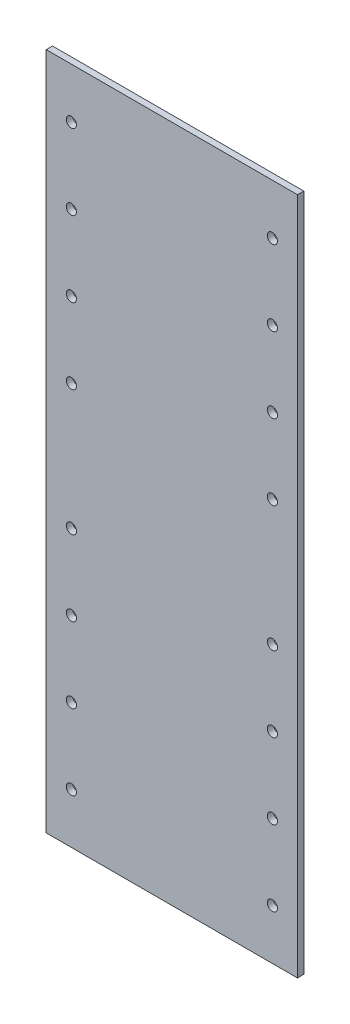
ISO-10303-21;
HEADER;
FILE_DESCRIPTION(('STEP AP214'),'2;1');
FILE_NAME('part.step','',(''),(''),'','','');
FILE_SCHEMA(('AUTOMOTIVE_DESIGN { 1 0 10303 214 1 1 1 1 }'));
ENDSEC;
DATA;
#1=APPLICATION_CONTEXT('core data for automotive mechanical design processes');
#2=APPLICATION_PROTOCOL_DEFINITION('international standard','automotive_design',2000,#1);
#3=PRODUCT_CONTEXT('',#1,'mechanical');
#4=PRODUCT('Part','Part','',(#3));
#5=PRODUCT_RELATED_PRODUCT_CATEGORY('part','',(#4));
#6=PRODUCT_DEFINITION_FORMATION('','',#4);
#7=PRODUCT_DEFINITION_CONTEXT('part definition',#1,'design');
#8=PRODUCT_DEFINITION('design','',#6,#7);
#9=PRODUCT_DEFINITION_SHAPE('','',#8);
#10=(LENGTH_UNIT() NAMED_UNIT(*) SI_UNIT(.MILLI.,.METRE.));
#11=(NAMED_UNIT(*) PLANE_ANGLE_UNIT() SI_UNIT($,.RADIAN.));
#12=(NAMED_UNIT(*) SI_UNIT($,.STERADIAN.) SOLID_ANGLE_UNIT());
#13=UNCERTAINTY_MEASURE_WITH_UNIT(LENGTH_MEASURE(1.E-05),#10,'distance_accuracy_value','');
#14=(GEOMETRIC_REPRESENTATION_CONTEXT(3) GLOBAL_UNCERTAINTY_ASSIGNED_CONTEXT((#13)) GLOBAL_UNIT_ASSIGNED_CONTEXT((#10,
#11,#12)) REPRESENTATION_CONTEXT('',''));
#15=CARTESIAN_POINT('',(0.,0.,0.));
#16=DIRECTION('',(0.,0.,1.));
#17=DIRECTION('',(1.,0.,0.));
#18=AXIS2_PLACEMENT_3D('',#15,#16,#17);
#19=CARTESIAN_POINT('',(63.5,-171.45,3.175));
#20=DIRECTION('',(-1.,0.,0.));
#21=DIRECTION('',(0.,0.,1.));
#22=AXIS2_PLACEMENT_3D('',#19,#20,#21);
#23=PLANE('',#22);
#24=DIRECTION('',(0.,1.,0.));
#25=VECTOR('',#24,1.);
#26=CARTESIAN_POINT('',(63.5,-171.45,0.));
#27=LINE('',#26,#25);
#28=CARTESIAN_POINT('',(63.5,-171.45,0.));
#29=VERTEX_POINT('',#28);
#30=CARTESIAN_POINT('',(63.5,171.45,0.));
#31=VERTEX_POINT('',#30);
#32=EDGE_CURVE('E96',#29,#31,#27,.T.);
#33=ORIENTED_EDGE('',*,*,#32,.T.);
#34=DIRECTION('',(0.,0.,-1.));
#35=VECTOR('',#34,1.);
#36=CARTESIAN_POINT('',(63.5,171.45,3.175));
#37=LINE('',#36,#35);
#38=CARTESIAN_POINT('',(63.5,171.45,3.175));
#39=VERTEX_POINT('',#38);
#40=EDGE_CURVE('E11',#39,#31,#37,.T.);
#41=ORIENTED_EDGE('',*,*,#40,.F.);
#42=DIRECTION('',(0.,1.,0.));
#43=VECTOR('',#42,1.);
#44=CARTESIAN_POINT('',(63.5,-171.45,3.175));
#45=LINE('',#44,#43);
#46=CARTESIAN_POINT('',(63.5,-171.45,3.175));
#47=VERTEX_POINT('',#46);
#48=EDGE_CURVE('E84',#47,#39,#45,.T.);
#49=ORIENTED_EDGE('',*,*,#48,.F.);
#50=DIRECTION('',(0.,0.,-1.));
#51=VECTOR('',#50,1.);
#52=CARTESIAN_POINT('',(63.5,-171.45,3.175));
#53=LINE('',#52,#51);
#54=EDGE_CURVE('E92',#47,#29,#53,.T.);
#55=ORIENTED_EDGE('',*,*,#54,.T.);
#56=EDGE_LOOP('',(#33,#41,#49,#55));
#57=FACE_BOUND('',#56,.T.);
#58=ADVANCED_FACE('F33',(#57),#23,.F.);
#59=CARTESIAN_POINT('',(-63.5,171.45,3.175));
#60=DIRECTION('',(0.,-1.,0.));
#61=DIRECTION('',(0.,0.,-1.));
#62=AXIS2_PLACEMENT_3D('',#59,#60,#61);
#63=PLANE('',#62);
#64=DIRECTION('',(-1.,0.,0.));
#65=VECTOR('',#64,1.);
#66=CARTESIAN_POINT('',(-63.5,171.45,0.));
#67=LINE('',#66,#65);
#68=CARTESIAN_POINT('',(-63.5,171.45,0.));
#69=VERTEX_POINT('',#68);
#70=EDGE_CURVE('E88',#31,#69,#67,.T.);
#71=ORIENTED_EDGE('',*,*,#70,.T.);
#72=DIRECTION('',(0.,0.,-1.));
#73=VECTOR('',#72,1.);
#74=CARTESIAN_POINT('',(-63.5,171.45,3.175));
#75=LINE('',#74,#73);
#76=CARTESIAN_POINT('',(-63.5,171.45,3.175));
#77=VERTEX_POINT('',#76);
#78=EDGE_CURVE('E41',#77,#69,#75,.T.);
#79=ORIENTED_EDGE('',*,*,#78,.F.);
#80=DIRECTION('',(-1.,0.,0.));
#81=VECTOR('',#80,1.);
#82=CARTESIAN_POINT('',(-63.5,171.45,3.175));
#83=LINE('',#82,#81);
#84=EDGE_CURVE('E79',#39,#77,#83,.T.);
#85=ORIENTED_EDGE('',*,*,#84,.F.);
#86=ORIENTED_EDGE('',*,*,#40,.T.);
#87=EDGE_LOOP('',(#71,#79,#85,#86));
#88=FACE_BOUND('',#87,.T.);
#89=ADVANCED_FACE('F87',(#88),#63,.F.);
#90=CARTESIAN_POINT('',(-63.5,-171.45,3.175));
#91=DIRECTION('',(1.,0.,0.));
#92=DIRECTION('',(0.,0.,-1.));
#93=AXIS2_PLACEMENT_3D('',#90,#91,#92);
#94=PLANE('',#93);
#95=DIRECTION('',(0.,-1.,0.));
#96=VECTOR('',#95,1.);
#97=CARTESIAN_POINT('',(-63.5,-171.45,0.));
#98=LINE('',#97,#96);
#99=CARTESIAN_POINT('',(-63.5,-171.45,0.));
#100=VERTEX_POINT('',#99);
#101=EDGE_CURVE('E66',#69,#100,#98,.T.);
#102=ORIENTED_EDGE('',*,*,#101,.T.);
#103=DIRECTION('',(0.,0.,-1.));
#104=VECTOR('',#103,1.);
#105=CARTESIAN_POINT('',(-63.5,-171.45,3.175));
#106=LINE('',#105,#104);
#107=CARTESIAN_POINT('',(-63.5,-171.45,3.175));
#108=VERTEX_POINT('',#107);
#109=EDGE_CURVE('E89',#108,#100,#106,.T.);
#110=ORIENTED_EDGE('',*,*,#109,.F.);
#111=DIRECTION('',(0.,-1.,0.));
#112=VECTOR('',#111,1.);
#113=CARTESIAN_POINT('',(-63.5,-171.45,3.175));
#114=LINE('',#113,#112);
#115=EDGE_CURVE('E82',#77,#108,#114,.T.);
#116=ORIENTED_EDGE('',*,*,#115,.F.);
#117=ORIENTED_EDGE('',*,*,#78,.T.);
#118=EDGE_LOOP('',(#102,#110,#116,#117));
#119=FACE_BOUND('',#118,.T.);
#120=ADVANCED_FACE('F90',(#119),#94,.F.);
#121=CARTESIAN_POINT('',(-63.5,-171.45,3.175));
#122=DIRECTION('',(0.,1.,0.));
#123=DIRECTION('',(0.,0.,1.));
#124=AXIS2_PLACEMENT_3D('',#121,#122,#123);
#125=PLANE('',#124);
#126=DIRECTION('',(1.,0.,0.));
#127=VECTOR('',#126,1.);
#128=CARTESIAN_POINT('',(-63.5,-171.45,0.));
#129=LINE('',#128,#127);
#130=EDGE_CURVE('E72',#100,#29,#129,.T.);
#131=ORIENTED_EDGE('',*,*,#130,.T.);
#132=ORIENTED_EDGE('',*,*,#54,.F.);
#133=DIRECTION('',(1.,0.,0.));
#134=VECTOR('',#133,1.);
#135=CARTESIAN_POINT('',(-63.5,-171.45,3.175));
#136=LINE('',#135,#134);
#137=EDGE_CURVE('E49',#108,#47,#136,.T.);
#138=ORIENTED_EDGE('',*,*,#137,.F.);
#139=ORIENTED_EDGE('',*,*,#109,.T.);
#140=EDGE_LOOP('',(#131,#132,#138,#139));
#141=FACE_BOUND('',#140,.T.);
#142=ADVANCED_FACE('F104',(#141),#125,.F.);
#143=CARTESIAN_POINT('',(0.,0.,3.175));
#144=DIRECTION('',(0.,0.,-1.));
#145=DIRECTION('',(-1.,0.,0.));
#146=AXIS2_PLACEMENT_3D('',#143,#144,#145);
#147=PLANE('',#146);
#148=CARTESIAN_POINT('',(50.8,-31.75,3.175));
#149=DIRECTION('',(0.,0.,-1.));
#150=DIRECTION('',(-1.,0.,0.));
#151=AXIS2_PLACEMENT_3D('',#148,#149,#150);
#152=CIRCLE('',#151,2.5796875);
#153=CARTESIAN_POINT('',(48.2203125,-31.75,3.175));
#154=VERTEX_POINT('',#153);
#155=EDGE_CURVE('E182',#154,#154,#152,.T.);
#156=ORIENTED_EDGE('',*,*,#155,.T.);
#157=EDGE_LOOP('',(#156));
#158=FACE_BOUND('',#157,.T.);
#159=CARTESIAN_POINT('',(50.8,31.75,3.175));
#160=DIRECTION('',(0.,0.,-1.));
#161=DIRECTION('',(-1.,0.,0.));
#162=AXIS2_PLACEMENT_3D('',#159,#160,#161);
#163=CIRCLE('',#162,2.5796875);
#164=CARTESIAN_POINT('',(48.2203125,31.75,3.175));
#165=VERTEX_POINT('',#164);
#166=EDGE_CURVE('E188',#165,#165,#163,.T.);
#167=ORIENTED_EDGE('',*,*,#166,.T.);
#168=EDGE_LOOP('',(#167));
#169=FACE_BOUND('',#168,.T.);
#170=CARTESIAN_POINT('',(50.8,146.05,3.175));
#171=DIRECTION('',(0.,0.,-1.));
#172=DIRECTION('',(-1.,0.,0.));
#173=AXIS2_PLACEMENT_3D('',#170,#171,#172);
#174=CIRCLE('',#173,2.57968749999999);
#175=CARTESIAN_POINT('',(48.2203125,146.05,3.175));
#176=VERTEX_POINT('',#175);
#177=EDGE_CURVE('E194',#176,#176,#174,.T.);
#178=ORIENTED_EDGE('',*,*,#177,.T.);
#179=EDGE_LOOP('',(#178));
#180=FACE_BOUND('',#179,.T.);
#181=CARTESIAN_POINT('',(50.8,107.95,3.175));
#182=DIRECTION('',(0.,0.,-1.));
#183=DIRECTION('',(-1.,0.,0.));
#184=AXIS2_PLACEMENT_3D('',#181,#182,#183);
#185=CIRCLE('',#184,2.5796875);
#186=CARTESIAN_POINT('',(48.2203125,107.95,3.175));
#187=VERTEX_POINT('',#186);
#188=EDGE_CURVE('E200',#187,#187,#185,.T.);
#189=ORIENTED_EDGE('',*,*,#188,.T.);
#190=EDGE_LOOP('',(#189));
#191=FACE_BOUND('',#190,.T.);
#192=CARTESIAN_POINT('',(50.8,69.85,3.175));
#193=DIRECTION('',(0.,0.,-1.));
#194=DIRECTION('',(-1.,0.,0.));
#195=AXIS2_PLACEMENT_3D('',#192,#193,#194);
#196=CIRCLE('',#195,2.5796875);
#197=CARTESIAN_POINT('',(48.2203125,69.85,3.175));
#198=VERTEX_POINT('',#197);
#199=EDGE_CURVE('E164',#198,#198,#196,.T.);
#200=ORIENTED_EDGE('',*,*,#199,.T.);
#201=EDGE_LOOP('',(#200));
#202=FACE_BOUND('',#201,.T.);
#203=CARTESIAN_POINT('',(50.7999999999999,-69.85,3.175));
#204=DIRECTION('',(0.,0.,-1.));
#205=DIRECTION('',(-1.,0.,0.));
#206=AXIS2_PLACEMENT_3D('',#203,#204,#205);
#207=CIRCLE('',#206,2.5796875);
#208=CARTESIAN_POINT('',(48.2203124999999,-69.85,3.175));
#209=VERTEX_POINT('',#208);
#210=EDGE_CURVE('E171',#209,#209,#207,.T.);
#211=ORIENTED_EDGE('',*,*,#210,.T.);
#212=EDGE_LOOP('',(#211));
#213=FACE_BOUND('',#212,.T.);
#214=CARTESIAN_POINT('',(50.7999999999999,-107.95,3.175));
#215=DIRECTION('',(0.,0.,-1.));
#216=DIRECTION('',(-1.,0.,0.));
#217=AXIS2_PLACEMENT_3D('',#214,#215,#216);
#218=CIRCLE('',#217,2.5796875);
#219=CARTESIAN_POINT('',(48.2203124999999,-107.95,3.175));
#220=VERTEX_POINT('',#219);
#221=EDGE_CURVE('E177',#220,#220,#218,.T.);
#222=ORIENTED_EDGE('',*,*,#221,.T.);
#223=EDGE_LOOP('',(#222));
#224=FACE_BOUND('',#223,.T.);
#225=CARTESIAN_POINT('',(50.7999999999999,-146.05,3.175));
#226=DIRECTION('',(0.,0.,-1.));
#227=DIRECTION('',(-1.,0.,0.));
#228=AXIS2_PLACEMENT_3D('',#225,#226,#227);
#229=CIRCLE('',#228,2.57968749999999);
#230=CARTESIAN_POINT('',(48.2203124999999,-146.05,3.175));
#231=VERTEX_POINT('',#230);
#232=EDGE_CURVE('E158',#231,#231,#229,.T.);
#233=ORIENTED_EDGE('',*,*,#232,.T.);
#234=EDGE_LOOP('',(#233));
#235=FACE_BOUND('',#234,.T.);
#236=CARTESIAN_POINT('',(-50.8,-31.75,3.175));
#237=DIRECTION('',(0.,0.,1.));
#238=DIRECTION('',(1.,0.,0.));
#239=AXIS2_PLACEMENT_3D('',#236,#237,#238);
#240=CIRCLE('',#239,2.5796875);
#241=CARTESIAN_POINT('',(-48.2203125,-31.75,3.175));
#242=VERTEX_POINT('',#241);
#243=EDGE_CURVE('E134',#242,#242,#240,.T.);
#244=ORIENTED_EDGE('',*,*,#243,.F.);
#245=EDGE_LOOP('',(#244));
#246=FACE_BOUND('',#245,.T.);
#247=CARTESIAN_POINT('',(-50.8,31.75,3.175));
#248=DIRECTION('',(0.,0.,1.));
#249=DIRECTION('',(1.,0.,0.));
#250=AXIS2_PLACEMENT_3D('',#247,#248,#249);
#251=CIRCLE('',#250,2.5796875);
#252=CARTESIAN_POINT('',(-48.2203125,31.75,3.175));
#253=VERTEX_POINT('',#252);
#254=EDGE_CURVE('E141',#253,#253,#251,.T.);
#255=ORIENTED_EDGE('',*,*,#254,.F.);
#256=EDGE_LOOP('',(#255));
#257=FACE_BOUND('',#256,.T.);
#258=CARTESIAN_POINT('',(-50.8,146.05,3.175));
#259=DIRECTION('',(0.,0.,1.));
#260=DIRECTION('',(1.,0.,0.));
#261=AXIS2_PLACEMENT_3D('',#258,#259,#260);
#262=CIRCLE('',#261,2.57968749999999);
#263=CARTESIAN_POINT('',(-48.2203125,146.05,3.175));
#264=VERTEX_POINT('',#263);
#265=EDGE_CURVE('E147',#264,#264,#262,.T.);
#266=ORIENTED_EDGE('',*,*,#265,.F.);
#267=EDGE_LOOP('',(#266));
#268=FACE_BOUND('',#267,.T.);
#269=CARTESIAN_POINT('',(-50.8,107.95,3.175));
#270=DIRECTION('',(0.,0.,1.));
#271=DIRECTION('',(1.,0.,0.));
#272=AXIS2_PLACEMENT_3D('',#269,#270,#271);
#273=CIRCLE('',#272,2.5796875);
#274=CARTESIAN_POINT('',(-48.2203125,107.95,3.175));
#275=VERTEX_POINT('',#274);
#276=EDGE_CURVE('E153',#275,#275,#273,.T.);
#277=ORIENTED_EDGE('',*,*,#276,.F.);
#278=EDGE_LOOP('',(#277));
#279=FACE_BOUND('',#278,.T.);
#280=CARTESIAN_POINT('',(-50.8,69.85,3.175));
#281=DIRECTION('',(0.,0.,1.));
#282=DIRECTION('',(1.,0.,0.));
#283=AXIS2_PLACEMENT_3D('',#280,#281,#282);
#284=CIRCLE('',#283,2.5796875);
#285=CARTESIAN_POINT('',(-48.2203125,69.85,3.175));
#286=VERTEX_POINT('',#285);
#287=EDGE_CURVE('E116',#286,#286,#284,.T.);
#288=ORIENTED_EDGE('',*,*,#287,.F.);
#289=EDGE_LOOP('',(#288));
#290=FACE_BOUND('',#289,.T.);
#291=CARTESIAN_POINT('',(-50.7999999999999,-69.85,3.175));
#292=DIRECTION('',(0.,0.,1.));
#293=DIRECTION('',(1.,0.,0.));
#294=AXIS2_PLACEMENT_3D('',#291,#292,#293);
#295=CIRCLE('',#294,2.5796875);
#296=CARTESIAN_POINT('',(-48.2203124999999,-69.85,3.175));
#297=VERTEX_POINT('',#296);
#298=EDGE_CURVE('E123',#297,#297,#295,.T.);
#299=ORIENTED_EDGE('',*,*,#298,.F.);
#300=EDGE_LOOP('',(#299));
#301=FACE_BOUND('',#300,.T.);
#302=CARTESIAN_POINT('',(-50.7999999999999,-107.95,3.175));
#303=DIRECTION('',(0.,0.,1.));
#304=DIRECTION('',(1.,0.,0.));
#305=AXIS2_PLACEMENT_3D('',#302,#303,#304);
#306=CIRCLE('',#305,2.5796875);
#307=CARTESIAN_POINT('',(-48.2203124999999,-107.95,3.175));
#308=VERTEX_POINT('',#307);
#309=EDGE_CURVE('E129',#308,#308,#306,.T.);
#310=ORIENTED_EDGE('',*,*,#309,.F.);
#311=EDGE_LOOP('',(#310));
#312=FACE_BOUND('',#311,.T.);
#313=CARTESIAN_POINT('',(-50.7999999999999,-146.05,3.175));
#314=DIRECTION('',(0.,0.,1.));
#315=DIRECTION('',(1.,0.,0.));
#316=AXIS2_PLACEMENT_3D('',#313,#314,#315);
#317=CIRCLE('',#316,2.57968749999999);
#318=CARTESIAN_POINT('',(-48.2203124999999,-146.05,3.175));
#319=VERTEX_POINT('',#318);
#320=EDGE_CURVE('E110',#319,#319,#317,.T.);
#321=ORIENTED_EDGE('',*,*,#320,.F.);
#322=EDGE_LOOP('',(#321));
#323=FACE_BOUND('',#322,.T.);
#324=ORIENTED_EDGE('',*,*,#48,.T.);
#325=ORIENTED_EDGE('',*,*,#84,.T.);
#326=ORIENTED_EDGE('',*,*,#115,.T.);
#327=ORIENTED_EDGE('',*,*,#137,.T.);
#328=EDGE_LOOP('',(#324,#325,#326,#327));
#329=FACE_BOUND('',#328,.T.);
#330=ADVANCED_FACE('F80',(#158,#169,#180,#191,#202,#213,#224,#235,#246,#257,#268,#279,#290,#301,
#312,#323,#329),#147,.F.);
#331=CARTESIAN_POINT('',(0.,0.,0.));
#332=DIRECTION('',(0.,0.,-1.));
#333=DIRECTION('',(-1.,0.,0.));
#334=AXIS2_PLACEMENT_3D('',#331,#332,#333);
#335=PLANE('',#334);
#336=CARTESIAN_POINT('',(50.8,-31.75,0.));
#337=DIRECTION('',(0.,0.,-1.));
#338=DIRECTION('',(-1.,0.,0.));
#339=AXIS2_PLACEMENT_3D('',#336,#337,#338);
#340=CIRCLE('',#339,2.5796875);
#341=CARTESIAN_POINT('',(48.2203125,-31.75,0.));
#342=VERTEX_POINT('',#341);
#343=EDGE_CURVE('E185',#342,#342,#340,.T.);
#344=ORIENTED_EDGE('',*,*,#343,.F.);
#345=EDGE_LOOP('',(#344));
#346=FACE_BOUND('',#345,.T.);
#347=CARTESIAN_POINT('',(50.8,31.75,0.));
#348=DIRECTION('',(0.,0.,-1.));
#349=DIRECTION('',(-1.,0.,0.));
#350=AXIS2_PLACEMENT_3D('',#347,#348,#349);
#351=CIRCLE('',#350,2.5796875);
#352=CARTESIAN_POINT('',(48.2203125,31.75,0.));
#353=VERTEX_POINT('',#352);
#354=EDGE_CURVE('E191',#353,#353,#351,.T.);
#355=ORIENTED_EDGE('',*,*,#354,.F.);
#356=EDGE_LOOP('',(#355));
#357=FACE_BOUND('',#356,.T.);
#358=CARTESIAN_POINT('',(50.8,146.05,0.));
#359=DIRECTION('',(0.,0.,-1.));
#360=DIRECTION('',(-1.,0.,0.));
#361=AXIS2_PLACEMENT_3D('',#358,#359,#360);
#362=CIRCLE('',#361,2.57968749999999);
#363=CARTESIAN_POINT('',(48.2203125,146.05,0.));
#364=VERTEX_POINT('',#363);
#365=EDGE_CURVE('E197',#364,#364,#362,.T.);
#366=ORIENTED_EDGE('',*,*,#365,.F.);
#367=EDGE_LOOP('',(#366));
#368=FACE_BOUND('',#367,.T.);
#369=CARTESIAN_POINT('',(50.8,107.95,0.));
#370=DIRECTION('',(0.,0.,-1.));
#371=DIRECTION('',(-1.,0.,0.));
#372=AXIS2_PLACEMENT_3D('',#369,#370,#371);
#373=CIRCLE('',#372,2.5796875);
#374=CARTESIAN_POINT('',(48.2203125,107.95,0.));
#375=VERTEX_POINT('',#374);
#376=EDGE_CURVE('E168',#375,#375,#373,.T.);
#377=ORIENTED_EDGE('',*,*,#376,.F.);
#378=EDGE_LOOP('',(#377));
#379=FACE_BOUND('',#378,.T.);
#380=CARTESIAN_POINT('',(50.8,69.85,0.));
#381=DIRECTION('',(0.,0.,-1.));
#382=DIRECTION('',(-1.,0.,0.));
#383=AXIS2_PLACEMENT_3D('',#380,#381,#382);
#384=CIRCLE('',#383,2.5796875);
#385=CARTESIAN_POINT('',(48.2203125,69.85,0.));
#386=VERTEX_POINT('',#385);
#387=EDGE_CURVE('E167',#386,#386,#384,.T.);
#388=ORIENTED_EDGE('',*,*,#387,.F.);
#389=EDGE_LOOP('',(#388));
#390=FACE_BOUND('',#389,.T.);
#391=CARTESIAN_POINT('',(50.7999999999999,-69.85,0.));
#392=DIRECTION('',(0.,0.,-1.));
#393=DIRECTION('',(-1.,0.,0.));
#394=AXIS2_PLACEMENT_3D('',#391,#392,#393);
#395=CIRCLE('',#394,2.5796875);
#396=CARTESIAN_POINT('',(48.2203124999999,-69.85,0.));
#397=VERTEX_POINT('',#396);
#398=EDGE_CURVE('E174',#397,#397,#395,.T.);
#399=ORIENTED_EDGE('',*,*,#398,.F.);
#400=EDGE_LOOP('',(#399));
#401=FACE_BOUND('',#400,.T.);
#402=CARTESIAN_POINT('',(50.7999999999999,-107.95,0.));
#403=DIRECTION('',(0.,0.,-1.));
#404=DIRECTION('',(-1.,0.,0.));
#405=AXIS2_PLACEMENT_3D('',#402,#403,#404);
#406=CIRCLE('',#405,2.5796875);
#407=CARTESIAN_POINT('',(48.2203124999999,-107.95,0.));
#408=VERTEX_POINT('',#407);
#409=EDGE_CURVE('E161',#408,#408,#406,.T.);
#410=ORIENTED_EDGE('',*,*,#409,.F.);
#411=EDGE_LOOP('',(#410));
#412=FACE_BOUND('',#411,.T.);
#413=CARTESIAN_POINT('',(50.7999999999999,-146.05,0.));
#414=DIRECTION('',(0.,0.,-1.));
#415=DIRECTION('',(-1.,0.,0.));
#416=AXIS2_PLACEMENT_3D('',#413,#414,#415);
#417=CIRCLE('',#416,2.57968749999999);
#418=CARTESIAN_POINT('',(48.2203124999999,-146.05,0.));
#419=VERTEX_POINT('',#418);
#420=EDGE_CURVE('E138',#419,#419,#417,.T.);
#421=ORIENTED_EDGE('',*,*,#420,.F.);
#422=EDGE_LOOP('',(#421));
#423=FACE_BOUND('',#422,.T.);
#424=CARTESIAN_POINT('',(-50.8,-31.75,0.));
#425=DIRECTION('',(0.,0.,1.));
#426=DIRECTION('',(1.,0.,0.));
#427=AXIS2_PLACEMENT_3D('',#424,#425,#426);
#428=CIRCLE('',#427,2.5796875);
#429=CARTESIAN_POINT('',(-48.2203125,-31.75,0.));
#430=VERTEX_POINT('',#429);
#431=EDGE_CURVE('E137',#430,#430,#428,.T.);
#432=ORIENTED_EDGE('',*,*,#431,.T.);
#433=EDGE_LOOP('',(#432));
#434=FACE_BOUND('',#433,.T.);
#435=CARTESIAN_POINT('',(-50.8,31.75,0.));
#436=DIRECTION('',(0.,0.,1.));
#437=DIRECTION('',(1.,0.,0.));
#438=AXIS2_PLACEMENT_3D('',#435,#436,#437);
#439=CIRCLE('',#438,2.5796875);
#440=CARTESIAN_POINT('',(-48.2203125,31.75,0.));
#441=VERTEX_POINT('',#440);
#442=EDGE_CURVE('E144',#441,#441,#439,.T.);
#443=ORIENTED_EDGE('',*,*,#442,.T.);
#444=EDGE_LOOP('',(#443));
#445=FACE_BOUND('',#444,.T.);
#446=CARTESIAN_POINT('',(-50.8,146.05,0.));
#447=DIRECTION('',(0.,0.,1.));
#448=DIRECTION('',(1.,0.,0.));
#449=AXIS2_PLACEMENT_3D('',#446,#447,#448);
#450=CIRCLE('',#449,2.57968749999999);
#451=CARTESIAN_POINT('',(-48.2203125,146.05,0.));
#452=VERTEX_POINT('',#451);
#453=EDGE_CURVE('E150',#452,#452,#450,.T.);
#454=ORIENTED_EDGE('',*,*,#453,.T.);
#455=EDGE_LOOP('',(#454));
#456=FACE_BOUND('',#455,.T.);
#457=CARTESIAN_POINT('',(-50.8,107.95,0.));
#458=DIRECTION('',(0.,0.,1.));
#459=DIRECTION('',(1.,0.,0.));
#460=AXIS2_PLACEMENT_3D('',#457,#458,#459);
#461=CIRCLE('',#460,2.5796875);
#462=CARTESIAN_POINT('',(-48.2203125,107.95,0.));
#463=VERTEX_POINT('',#462);
#464=EDGE_CURVE('E120',#463,#463,#461,.T.);
#465=ORIENTED_EDGE('',*,*,#464,.T.);
#466=EDGE_LOOP('',(#465));
#467=FACE_BOUND('',#466,.T.);
#468=CARTESIAN_POINT('',(-50.8,69.85,0.));
#469=DIRECTION('',(0.,0.,1.));
#470=DIRECTION('',(1.,0.,0.));
#471=AXIS2_PLACEMENT_3D('',#468,#469,#470);
#472=CIRCLE('',#471,2.5796875);
#473=CARTESIAN_POINT('',(-48.2203125,69.85,0.));
#474=VERTEX_POINT('',#473);
#475=EDGE_CURVE('E119',#474,#474,#472,.T.);
#476=ORIENTED_EDGE('',*,*,#475,.T.);
#477=EDGE_LOOP('',(#476));
#478=FACE_BOUND('',#477,.T.);
#479=CARTESIAN_POINT('',(-50.7999999999999,-69.85,0.));
#480=DIRECTION('',(0.,0.,1.));
#481=DIRECTION('',(1.,0.,0.));
#482=AXIS2_PLACEMENT_3D('',#479,#480,#481);
#483=CIRCLE('',#482,2.5796875);
#484=CARTESIAN_POINT('',(-48.2203124999999,-69.85,0.));
#485=VERTEX_POINT('',#484);
#486=EDGE_CURVE('E126',#485,#485,#483,.T.);
#487=ORIENTED_EDGE('',*,*,#486,.T.);
#488=EDGE_LOOP('',(#487));
#489=FACE_BOUND('',#488,.T.);
#490=CARTESIAN_POINT('',(-50.7999999999999,-107.95,0.));
#491=DIRECTION('',(0.,0.,1.));
#492=DIRECTION('',(1.,0.,0.));
#493=AXIS2_PLACEMENT_3D('',#490,#491,#492);
#494=CIRCLE('',#493,2.5796875);
#495=CARTESIAN_POINT('',(-48.2203124999999,-107.95,0.));
#496=VERTEX_POINT('',#495);
#497=EDGE_CURVE('E113',#496,#496,#494,.T.);
#498=ORIENTED_EDGE('',*,*,#497,.T.);
#499=EDGE_LOOP('',(#498));
#500=FACE_BOUND('',#499,.T.);
#501=CARTESIAN_POINT('',(-50.7999999999999,-146.05,0.));
#502=DIRECTION('',(0.,0.,1.));
#503=DIRECTION('',(1.,0.,0.));
#504=AXIS2_PLACEMENT_3D('',#501,#502,#503);
#505=CIRCLE('',#504,2.57968749999999);
#506=CARTESIAN_POINT('',(-48.2203124999999,-146.05,0.));
#507=VERTEX_POINT('',#506);
#508=EDGE_CURVE('E99',#507,#507,#505,.T.);
#509=ORIENTED_EDGE('',*,*,#508,.T.);
#510=EDGE_LOOP('',(#509));
#511=FACE_BOUND('',#510,.T.);
#512=ORIENTED_EDGE('',*,*,#32,.F.);
#513=ORIENTED_EDGE('',*,*,#130,.F.);
#514=ORIENTED_EDGE('',*,*,#101,.F.);
#515=ORIENTED_EDGE('',*,*,#70,.F.);
#516=EDGE_LOOP('',(#512,#513,#514,#515));
#517=FACE_BOUND('',#516,.T.);
#518=ADVANCED_FACE('F107',(#346,#357,#368,#379,#390,#401,#412,#423,#434,#445,#456,#467,#478,
#489,#500,#511,#517),#335,.T.);
#519=CARTESIAN_POINT('',(-50.7999999999999,-146.05,0.));
#520=DIRECTION('',(0.,0.,1.));
#521=DIRECTION('',(1.,0.,0.));
#522=AXIS2_PLACEMENT_3D('',#519,#520,#521);
#523=CYLINDRICAL_SURFACE('',#522,2.57968749999999);
#524=ORIENTED_EDGE('',*,*,#508,.F.);
#525=EDGE_LOOP('',(#524));
#526=FACE_BOUND('',#525,.T.);
#527=ORIENTED_EDGE('',*,*,#320,.T.);
#528=EDGE_LOOP('',(#527));
#529=FACE_BOUND('',#528,.T.);
#530=ADVANCED_FACE('F211',(#526,#529),#523,.F.);
#531=CARTESIAN_POINT('',(-50.7999999999999,-107.95,0.));
#532=DIRECTION('',(0.,0.,1.));
#533=DIRECTION('',(1.,0.,0.));
#534=AXIS2_PLACEMENT_3D('',#531,#532,#533);
#535=CYLINDRICAL_SURFACE('',#534,2.5796875);
#536=ORIENTED_EDGE('',*,*,#497,.F.);
#537=EDGE_LOOP('',(#536));
#538=FACE_BOUND('',#537,.T.);
#539=ORIENTED_EDGE('',*,*,#309,.T.);
#540=EDGE_LOOP('',(#539));
#541=FACE_BOUND('',#540,.T.);
#542=ADVANCED_FACE('F240',(#538,#541),#535,.F.);
#543=CARTESIAN_POINT('',(-50.7999999999999,-69.85,0.));
#544=DIRECTION('',(0.,0.,1.));
#545=DIRECTION('',(1.,0.,0.));
#546=AXIS2_PLACEMENT_3D('',#543,#544,#545);
#547=CYLINDRICAL_SURFACE('',#546,2.5796875);
#548=ORIENTED_EDGE('',*,*,#486,.F.);
#549=EDGE_LOOP('',(#548));
#550=FACE_BOUND('',#549,.T.);
#551=ORIENTED_EDGE('',*,*,#298,.T.);
#552=EDGE_LOOP('',(#551));
#553=FACE_BOUND('',#552,.T.);
#554=ADVANCED_FACE('F283',(#550,#553),#547,.F.);
#555=CARTESIAN_POINT('',(-50.8,69.85,0.));
#556=DIRECTION('',(0.,0.,1.));
#557=DIRECTION('',(1.,0.,0.));
#558=AXIS2_PLACEMENT_3D('',#555,#556,#557);
#559=CYLINDRICAL_SURFACE('',#558,2.5796875);
#560=ORIENTED_EDGE('',*,*,#475,.F.);
#561=EDGE_LOOP('',(#560));
#562=FACE_BOUND('',#561,.T.);
#563=ORIENTED_EDGE('',*,*,#287,.T.);
#564=EDGE_LOOP('',(#563));
#565=FACE_BOUND('',#564,.T.);
#566=ADVANCED_FACE('F293',(#562,#565),#559,.F.);
#567=CARTESIAN_POINT('',(-50.8,107.95,0.));
#568=DIRECTION('',(0.,0.,1.));
#569=DIRECTION('',(1.,0.,0.));
#570=AXIS2_PLACEMENT_3D('',#567,#568,#569);
#571=CYLINDRICAL_SURFACE('',#570,2.5796875);
#572=ORIENTED_EDGE('',*,*,#464,.F.);
#573=EDGE_LOOP('',(#572));
#574=FACE_BOUND('',#573,.T.);
#575=ORIENTED_EDGE('',*,*,#276,.T.);
#576=EDGE_LOOP('',(#575));
#577=FACE_BOUND('',#576,.T.);
#578=ADVANCED_FACE('F303',(#574,#577),#571,.F.);
#579=CARTESIAN_POINT('',(-50.8,146.05,0.));
#580=DIRECTION('',(0.,0.,1.));
#581=DIRECTION('',(1.,0.,0.));
#582=AXIS2_PLACEMENT_3D('',#579,#580,#581);
#583=CYLINDRICAL_SURFACE('',#582,2.57968749999999);
#584=ORIENTED_EDGE('',*,*,#453,.F.);
#585=EDGE_LOOP('',(#584));
#586=FACE_BOUND('',#585,.T.);
#587=ORIENTED_EDGE('',*,*,#265,.T.);
#588=EDGE_LOOP('',(#587));
#589=FACE_BOUND('',#588,.T.);
#590=ADVANCED_FACE('F313',(#586,#589),#583,.F.);
#591=CARTESIAN_POINT('',(-50.8,31.75,0.));
#592=DIRECTION('',(0.,0.,1.));
#593=DIRECTION('',(1.,0.,0.));
#594=AXIS2_PLACEMENT_3D('',#591,#592,#593);
#595=CYLINDRICAL_SURFACE('',#594,2.5796875);
#596=ORIENTED_EDGE('',*,*,#442,.F.);
#597=EDGE_LOOP('',(#596));
#598=FACE_BOUND('',#597,.T.);
#599=ORIENTED_EDGE('',*,*,#254,.T.);
#600=EDGE_LOOP('',(#599));
#601=FACE_BOUND('',#600,.T.);
#602=ADVANCED_FACE('F323',(#598,#601),#595,.F.);
#603=CARTESIAN_POINT('',(-50.8,-31.75,0.));
#604=DIRECTION('',(0.,0.,1.));
#605=DIRECTION('',(1.,0.,0.));
#606=AXIS2_PLACEMENT_3D('',#603,#604,#605);
#607=CYLINDRICAL_SURFACE('',#606,2.5796875);
#608=ORIENTED_EDGE('',*,*,#431,.F.);
#609=EDGE_LOOP('',(#608));
#610=FACE_BOUND('',#609,.T.);
#611=ORIENTED_EDGE('',*,*,#243,.T.);
#612=EDGE_LOOP('',(#611));
#613=FACE_BOUND('',#612,.T.);
#614=ADVANCED_FACE('F333',(#610,#613),#607,.F.);
#615=CARTESIAN_POINT('',(50.7999999999999,-146.05,0.));
#616=DIRECTION('',(0.,0.,1.));
#617=DIRECTION('',(1.,0.,0.));
#618=AXIS2_PLACEMENT_3D('',#615,#616,#617);
#619=CYLINDRICAL_SURFACE('',#618,2.57968749999999);
#620=ORIENTED_EDGE('',*,*,#420,.T.);
#621=EDGE_LOOP('',(#620));
#622=FACE_BOUND('',#621,.T.);
#623=ORIENTED_EDGE('',*,*,#232,.F.);
#624=EDGE_LOOP('',(#623));
#625=FACE_BOUND('',#624,.T.);
#626=ADVANCED_FACE('F342',(#622,#625),#619,.F.);
#627=CARTESIAN_POINT('',(50.7999999999999,-107.95,0.));
#628=DIRECTION('',(0.,0.,1.));
#629=DIRECTION('',(1.,0.,0.));
#630=AXIS2_PLACEMENT_3D('',#627,#628,#629);
#631=CYLINDRICAL_SURFACE('',#630,2.5796875);
#632=ORIENTED_EDGE('',*,*,#409,.T.);
#633=EDGE_LOOP('',(#632));
#634=FACE_BOUND('',#633,.T.);
#635=ORIENTED_EDGE('',*,*,#221,.F.);
#636=EDGE_LOOP('',(#635));
#637=FACE_BOUND('',#636,.T.);
#638=ADVANCED_FACE('F361',(#634,#637),#631,.F.);
#639=CARTESIAN_POINT('',(50.7999999999999,-69.85,0.));
#640=DIRECTION('',(0.,0.,1.));
#641=DIRECTION('',(1.,0.,0.));
#642=AXIS2_PLACEMENT_3D('',#639,#640,#641);
#643=CYLINDRICAL_SURFACE('',#642,2.5796875);
#644=ORIENTED_EDGE('',*,*,#398,.T.);
#645=EDGE_LOOP('',(#644));
#646=FACE_BOUND('',#645,.T.);
#647=ORIENTED_EDGE('',*,*,#210,.F.);
#648=EDGE_LOOP('',(#647));
#649=FACE_BOUND('',#648,.T.);
#650=ADVANCED_FACE('F371',(#646,#649),#643,.F.);
#651=CARTESIAN_POINT('',(50.8,69.85,0.));
#652=DIRECTION('',(0.,0.,1.));
#653=DIRECTION('',(1.,0.,0.));
#654=AXIS2_PLACEMENT_3D('',#651,#652,#653);
#655=CYLINDRICAL_SURFACE('',#654,2.5796875);
#656=ORIENTED_EDGE('',*,*,#387,.T.);
#657=EDGE_LOOP('',(#656));
#658=FACE_BOUND('',#657,.T.);
#659=ORIENTED_EDGE('',*,*,#199,.F.);
#660=EDGE_LOOP('',(#659));
#661=FACE_BOUND('',#660,.T.);
#662=ADVANCED_FACE('F381',(#658,#661),#655,.F.);
#663=CARTESIAN_POINT('',(50.8,107.95,0.));
#664=DIRECTION('',(0.,0.,1.));
#665=DIRECTION('',(1.,0.,0.));
#666=AXIS2_PLACEMENT_3D('',#663,#664,#665);
#667=CYLINDRICAL_SURFACE('',#666,2.5796875);
#668=ORIENTED_EDGE('',*,*,#376,.T.);
#669=EDGE_LOOP('',(#668));
#670=FACE_BOUND('',#669,.T.);
#671=ORIENTED_EDGE('',*,*,#188,.F.);
#672=EDGE_LOOP('',(#671));
#673=FACE_BOUND('',#672,.T.);
#674=ADVANCED_FACE('F206',(#670,#673),#667,.F.);
#675=CARTESIAN_POINT('',(50.8,146.05,0.));
#676=DIRECTION('',(0.,0.,1.));
#677=DIRECTION('',(1.,0.,0.));
#678=AXIS2_PLACEMENT_3D('',#675,#676,#677);
#679=CYLINDRICAL_SURFACE('',#678,2.57968749999999);
#680=ORIENTED_EDGE('',*,*,#365,.T.);
#681=EDGE_LOOP('',(#680));
#682=FACE_BOUND('',#681,.T.);
#683=ORIENTED_EDGE('',*,*,#177,.F.);
#684=EDGE_LOOP('',(#683));
#685=FACE_BOUND('',#684,.T.);
#686=ADVANCED_FACE('F400',(#682,#685),#679,.F.);
#687=CARTESIAN_POINT('',(50.8,31.75,0.));
#688=DIRECTION('',(0.,0.,1.));
#689=DIRECTION('',(1.,0.,0.));
#690=AXIS2_PLACEMENT_3D('',#687,#688,#689);
#691=CYLINDRICAL_SURFACE('',#690,2.5796875);
#692=ORIENTED_EDGE('',*,*,#354,.T.);
#693=EDGE_LOOP('',(#692));
#694=FACE_BOUND('',#693,.T.);
#695=ORIENTED_EDGE('',*,*,#166,.F.);
#696=EDGE_LOOP('',(#695));
#697=FACE_BOUND('',#696,.T.);
#698=ADVANCED_FACE('F409',(#694,#697),#691,.F.);
#699=CARTESIAN_POINT('',(50.8,-31.75,0.));
#700=DIRECTION('',(0.,0.,1.));
#701=DIRECTION('',(1.,0.,0.));
#702=AXIS2_PLACEMENT_3D('',#699,#700,#701);
#703=CYLINDRICAL_SURFACE('',#702,2.5796875);
#704=ORIENTED_EDGE('',*,*,#343,.T.);
#705=EDGE_LOOP('',(#704));
#706=FACE_BOUND('',#705,.T.);
#707=ORIENTED_EDGE('',*,*,#155,.F.);
#708=EDGE_LOOP('',(#707));
#709=FACE_BOUND('',#708,.T.);
#710=ADVANCED_FACE('F419',(#706,#709),#703,.F.);
#711=CLOSED_SHELL('',(#58,#89,#120,#142,#330,#518,#530,#542,#554,#566,#578,#590,#602,#614,#626,
#638,#650,#662,#674,#686,#698,#710));
#712=MANIFOLD_SOLID_BREP('B2',#711);
#713=ADVANCED_BREP_SHAPE_REPRESENTATION('',(#18,#712),#14);
#714=SHAPE_DEFINITION_REPRESENTATION(#9,#713);
ENDSEC;
END-ISO-10303-21;
